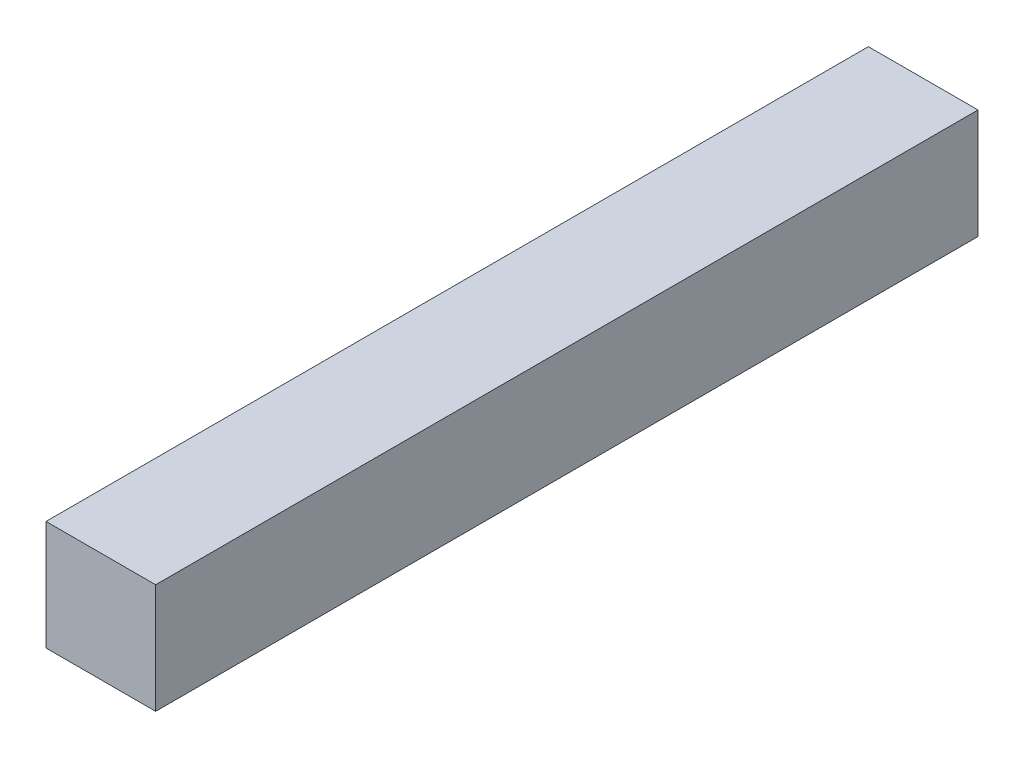
ISO-10303-21;
HEADER;
FILE_DESCRIPTION(('STEP AP214'),'2;1');
FILE_NAME('part.step','',(''),(''),'','','');
FILE_SCHEMA(('AUTOMOTIVE_DESIGN { 1 0 10303 214 1 1 1 1 }'));
ENDSEC;
DATA;
#1=APPLICATION_CONTEXT('core data for automotive mechanical design processes');
#2=APPLICATION_PROTOCOL_DEFINITION('international standard','automotive_design',2000,#1);
#3=PRODUCT_CONTEXT('',#1,'mechanical');
#4=PRODUCT('Part','Part','',(#3));
#5=PRODUCT_RELATED_PRODUCT_CATEGORY('part','',(#4));
#6=PRODUCT_DEFINITION_FORMATION('','',#4);
#7=PRODUCT_DEFINITION_CONTEXT('part definition',#1,'design');
#8=PRODUCT_DEFINITION('design','',#6,#7);
#9=PRODUCT_DEFINITION_SHAPE('','',#8);
#10=(LENGTH_UNIT() NAMED_UNIT(*) SI_UNIT(.MILLI.,.METRE.));
#11=(NAMED_UNIT(*) PLANE_ANGLE_UNIT() SI_UNIT($,.RADIAN.));
#12=(NAMED_UNIT(*) SI_UNIT($,.STERADIAN.) SOLID_ANGLE_UNIT());
#13=UNCERTAINTY_MEASURE_WITH_UNIT(LENGTH_MEASURE(1.E-05),#10,'distance_accuracy_value','');
#14=(GEOMETRIC_REPRESENTATION_CONTEXT(3) GLOBAL_UNCERTAINTY_ASSIGNED_CONTEXT((#13)) GLOBAL_UNIT_ASSIGNED_CONTEXT((#10,
#11,#12)) REPRESENTATION_CONTEXT('',''));
#15=CARTESIAN_POINT('',(0.,0.,0.));
#16=DIRECTION('',(0.,0.,1.));
#17=DIRECTION('',(1.,0.,0.));
#18=AXIS2_PLACEMENT_3D('',#15,#16,#17);
#19=CARTESIAN_POINT('',(-2.,2.,30.));
#20=DIRECTION('',(1.,0.,0.));
#21=DIRECTION('',(0.,0.,-1.));
#22=AXIS2_PLACEMENT_3D('',#19,#20,#21);
#23=PLANE('',#22);
#24=DIRECTION('',(0.,-1.,0.));
#25=VECTOR('',#24,1.);
#26=CARTESIAN_POINT('',(-2.,2.,0.));
#27=LINE('',#26,#25);
#28=CARTESIAN_POINT('',(-2.,2.,0.));
#29=VERTEX_POINT('',#28);
#30=CARTESIAN_POINT('',(-2.,-2.,0.));
#31=VERTEX_POINT('',#30);
#32=EDGE_CURVE('E96',#29,#31,#27,.T.);
#33=ORIENTED_EDGE('',*,*,#32,.T.);
#34=DIRECTION('',(0.,0.,-1.));
#35=VECTOR('',#34,1.);
#36=CARTESIAN_POINT('',(-2.,-2.,30.));
#37=LINE('',#36,#35);
#38=CARTESIAN_POINT('',(-2.,-2.,30.));
#39=VERTEX_POINT('',#38);
#40=EDGE_CURVE('E11',#39,#31,#37,.T.);
#41=ORIENTED_EDGE('',*,*,#40,.F.);
#42=DIRECTION('',(0.,-1.,0.));
#43=VECTOR('',#42,1.);
#44=CARTESIAN_POINT('',(-2.,2.,30.));
#45=LINE('',#44,#43);
#46=CARTESIAN_POINT('',(-2.,2.,30.));
#47=VERTEX_POINT('',#46);
#48=EDGE_CURVE('E82',#47,#39,#45,.T.);
#49=ORIENTED_EDGE('',*,*,#48,.F.);
#50=DIRECTION('',(0.,0.,-1.));
#51=VECTOR('',#50,1.);
#52=CARTESIAN_POINT('',(-2.,2.,30.));
#53=LINE('',#52,#51);
#54=EDGE_CURVE('E49',#47,#29,#53,.T.);
#55=ORIENTED_EDGE('',*,*,#54,.T.);
#56=EDGE_LOOP('',(#33,#41,#49,#55));
#57=FACE_BOUND('',#56,.T.);
#58=ADVANCED_FACE('F33',(#57),#23,.F.);
#59=CARTESIAN_POINT('',(-2.,-2.,30.));
#60=DIRECTION('',(0.,1.,0.));
#61=DIRECTION('',(0.,0.,1.));
#62=AXIS2_PLACEMENT_3D('',#59,#60,#61);
#63=PLANE('',#62);
#64=DIRECTION('',(1.,0.,0.));
#65=VECTOR('',#64,1.);
#66=CARTESIAN_POINT('',(-2.,-2.,0.));
#67=LINE('',#66,#65);
#68=CARTESIAN_POINT('',(2.,-2.,0.));
#69=VERTEX_POINT('',#68);
#70=EDGE_CURVE('E87',#31,#69,#67,.T.);
#71=ORIENTED_EDGE('',*,*,#70,.T.);
#72=DIRECTION('',(0.,0.,-1.));
#73=VECTOR('',#72,1.);
#74=CARTESIAN_POINT('',(2.,-2.,30.));
#75=LINE('',#74,#73);
#76=CARTESIAN_POINT('',(2.,-2.,30.));
#77=VERTEX_POINT('',#76);
#78=EDGE_CURVE('E41',#77,#69,#75,.T.);
#79=ORIENTED_EDGE('',*,*,#78,.F.);
#80=DIRECTION('',(1.,0.,0.));
#81=VECTOR('',#80,1.);
#82=CARTESIAN_POINT('',(-2.,-2.,30.));
#83=LINE('',#82,#81);
#84=EDGE_CURVE('E74',#39,#77,#83,.T.);
#85=ORIENTED_EDGE('',*,*,#84,.F.);
#86=ORIENTED_EDGE('',*,*,#40,.T.);
#87=EDGE_LOOP('',(#71,#79,#85,#86));
#88=FACE_BOUND('',#87,.T.);
#89=ADVANCED_FACE('F86',(#88),#63,.F.);
#90=CARTESIAN_POINT('',(2.,2.,30.));
#91=DIRECTION('',(1.,0.,0.));
#92=DIRECTION('',(0.,1.,0.));
#93=AXIS2_PLACEMENT_3D('',#90,#91,#92);
#94=PLANE('',#93);
#95=DIRECTION('',(0.,-1.,0.));
#96=VECTOR('',#95,1.);
#97=CARTESIAN_POINT('',(2.,2.,0.));
#98=LINE('',#97,#96);
#99=CARTESIAN_POINT('',(2.,2.,0.));
#100=VERTEX_POINT('',#99);
#101=EDGE_CURVE('E99',#100,#69,#98,.T.);
#102=ORIENTED_EDGE('',*,*,#101,.F.);
#103=DIRECTION('',(0.,0.,-1.));
#104=VECTOR('',#103,1.);
#105=CARTESIAN_POINT('',(2.,2.,30.));
#106=LINE('',#105,#104);
#107=CARTESIAN_POINT('',(2.,2.,30.));
#108=VERTEX_POINT('',#107);
#109=EDGE_CURVE('E63',#108,#100,#106,.T.);
#110=ORIENTED_EDGE('',*,*,#109,.F.);
#111=DIRECTION('',(0.,-1.,0.));
#112=VECTOR('',#111,1.);
#113=CARTESIAN_POINT('',(2.,2.,30.));
#114=LINE('',#113,#112);
#115=EDGE_CURVE('E81',#108,#77,#114,.T.);
#116=ORIENTED_EDGE('',*,*,#115,.T.);
#117=ORIENTED_EDGE('',*,*,#78,.T.);
#118=EDGE_LOOP('',(#102,#110,#116,#117));
#119=FACE_BOUND('',#118,.T.);
#120=ADVANCED_FACE('F90',(#119),#94,.T.);
#121=CARTESIAN_POINT('',(-2.,2.,30.));
#122=DIRECTION('',(0.,1.,0.));
#123=DIRECTION('',(0.,0.,1.));
#124=AXIS2_PLACEMENT_3D('',#121,#122,#123);
#125=PLANE('',#124);
#126=DIRECTION('',(1.,0.,0.));
#127=VECTOR('',#126,1.);
#128=CARTESIAN_POINT('',(-2.,2.,0.));
#129=LINE('',#128,#127);
#130=EDGE_CURVE('E101',#29,#100,#129,.T.);
#131=ORIENTED_EDGE('',*,*,#130,.F.);
#132=ORIENTED_EDGE('',*,*,#54,.F.);
#133=DIRECTION('',(1.,0.,0.));
#134=VECTOR('',#133,1.);
#135=CARTESIAN_POINT('',(-2.,2.,30.));
#136=LINE('',#135,#134);
#137=EDGE_CURVE('E91',#47,#108,#136,.T.);
#138=ORIENTED_EDGE('',*,*,#137,.T.);
#139=ORIENTED_EDGE('',*,*,#109,.T.);
#140=EDGE_LOOP('',(#131,#132,#138,#139));
#141=FACE_BOUND('',#140,.T.);
#142=ADVANCED_FACE('F107',(#141),#125,.T.);
#143=CARTESIAN_POINT('',(0.,0.,30.));
#144=DIRECTION('',(0.,0.,1.));
#145=DIRECTION('',(1.,0.,0.));
#146=AXIS2_PLACEMENT_3D('',#143,#144,#145);
#147=PLANE('',#146);
#148=ORIENTED_EDGE('',*,*,#48,.T.);
#149=ORIENTED_EDGE('',*,*,#84,.T.);
#150=ORIENTED_EDGE('',*,*,#115,.F.);
#151=ORIENTED_EDGE('',*,*,#137,.F.);
#152=EDGE_LOOP('',(#148,#149,#150,#151));
#153=FACE_BOUND('',#152,.T.);
#154=ADVANCED_FACE('F78',(#153),#147,.T.);
#155=CARTESIAN_POINT('',(0.,0.,0.));
#156=DIRECTION('',(0.,0.,1.));
#157=DIRECTION('',(1.,0.,0.));
#158=AXIS2_PLACEMENT_3D('',#155,#156,#157);
#159=PLANE('',#158);
#160=ORIENTED_EDGE('',*,*,#32,.F.);
#161=ORIENTED_EDGE('',*,*,#130,.T.);
#162=ORIENTED_EDGE('',*,*,#101,.T.);
#163=ORIENTED_EDGE('',*,*,#70,.F.);
#164=EDGE_LOOP('',(#160,#161,#162,#163));
#165=FACE_BOUND('',#164,.T.);
#166=ADVANCED_FACE('F106',(#165),#159,.F.);
#167=CLOSED_SHELL('',(#58,#89,#120,#142,#154,#166));
#168=MANIFOLD_SOLID_BREP('B2',#167);
#169=ADVANCED_BREP_SHAPE_REPRESENTATION('',(#18,#168),#14);
#170=SHAPE_DEFINITION_REPRESENTATION(#9,#169);
ENDSEC;
END-ISO-10303-21;
